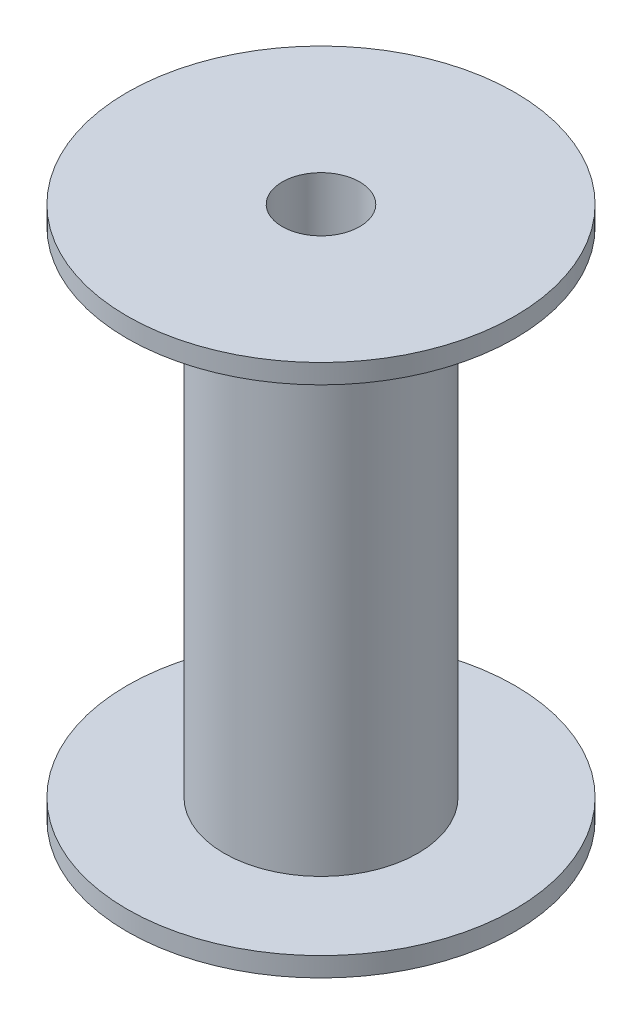
ISO-10303-21;
HEADER;
FILE_DESCRIPTION(('STEP AP214'),'2;1');
FILE_NAME('part.step','',(''),(''),'','','');
FILE_SCHEMA(('AUTOMOTIVE_DESIGN { 1 0 10303 214 1 1 1 1 }'));
ENDSEC;
DATA;
#1=APPLICATION_CONTEXT('core data for automotive mechanical design processes');
#2=APPLICATION_PROTOCOL_DEFINITION('international standard','automotive_design',2000,#1);
#3=PRODUCT_CONTEXT('',#1,'mechanical');
#4=PRODUCT('Part','Part','',(#3));
#5=PRODUCT_RELATED_PRODUCT_CATEGORY('part','',(#4));
#6=PRODUCT_DEFINITION_FORMATION('','',#4);
#7=PRODUCT_DEFINITION_CONTEXT('part definition',#1,'design');
#8=PRODUCT_DEFINITION('design','',#6,#7);
#9=PRODUCT_DEFINITION_SHAPE('','',#8);
#10=(LENGTH_UNIT() NAMED_UNIT(*) SI_UNIT(.MILLI.,.METRE.));
#11=(NAMED_UNIT(*) PLANE_ANGLE_UNIT() SI_UNIT($,.RADIAN.));
#12=(NAMED_UNIT(*) SI_UNIT($,.STERADIAN.) SOLID_ANGLE_UNIT());
#13=UNCERTAINTY_MEASURE_WITH_UNIT(LENGTH_MEASURE(1.E-05),#10,'distance_accuracy_value','');
#14=(GEOMETRIC_REPRESENTATION_CONTEXT(3) GLOBAL_UNCERTAINTY_ASSIGNED_CONTEXT((#13)) GLOBAL_UNIT_ASSIGNED_CONTEXT((#10,
#11,#12)) REPRESENTATION_CONTEXT('',''));
#15=CARTESIAN_POINT('',(0.,0.,0.));
#16=DIRECTION('',(0.,0.,1.));
#17=DIRECTION('',(1.,0.,0.));
#18=AXIS2_PLACEMENT_3D('',#15,#16,#17);
#19=CARTESIAN_POINT('',(0.,55.,0.));
#20=DIRECTION('',(0.,-1.,0.));
#21=DIRECTION('',(0.,0.,-1.));
#22=AXIS2_PLACEMENT_3D('',#19,#20,#21);
#23=CYLINDRICAL_SURFACE('',#22,20.);
#24=CARTESIAN_POINT('',(0.,0.,0.));
#25=DIRECTION('',(0.,1.,0.));
#26=DIRECTION('',(0.,0.,1.));
#27=AXIS2_PLACEMENT_3D('',#24,#25,#26);
#28=CIRCLE('',#27,20.);
#29=CARTESIAN_POINT('',(0.,0.,20.));
#30=VERTEX_POINT('',#29);
#31=EDGE_CURVE('E35',#30,#30,#28,.T.);
#32=ORIENTED_EDGE('',*,*,#31,.T.);
#33=EDGE_LOOP('',(#32));
#34=FACE_BOUND('',#33,.T.);
#35=CARTESIAN_POINT('',(0.,2.,0.));
#36=DIRECTION('',(0.,1.,0.));
#37=DIRECTION('',(0.,0.,1.));
#38=AXIS2_PLACEMENT_3D('',#35,#36,#37);
#39=CIRCLE('',#38,20.);
#40=CARTESIAN_POINT('',(0.,2.,20.));
#41=VERTEX_POINT('',#40);
#42=EDGE_CURVE('E47',#41,#41,#39,.T.);
#43=ORIENTED_EDGE('',*,*,#42,.F.);
#44=EDGE_LOOP('',(#43));
#45=FACE_BOUND('',#44,.T.);
#46=ADVANCED_FACE('F31',(#34,#45),#23,.T.);
#47=CARTESIAN_POINT('',(0.,55.,0.));
#48=DIRECTION('',(0.,1.,0.));
#49=DIRECTION('',(0.,0.,1.));
#50=AXIS2_PLACEMENT_3D('',#47,#48,#49);
#51=PLANE('',#50);
#52=CARTESIAN_POINT('',(0.,55.,0.));
#53=DIRECTION('',(0.,1.,0.));
#54=DIRECTION('',(0.,0.,1.));
#55=AXIS2_PLACEMENT_3D('',#52,#53,#54);
#56=CIRCLE('',#55,20.);
#57=CARTESIAN_POINT('',(0.,55.,20.));
#58=VERTEX_POINT('',#57);
#59=EDGE_CURVE('E10',#58,#58,#56,.T.);
#60=ORIENTED_EDGE('',*,*,#59,.T.);
#61=EDGE_LOOP('',(#60));
#62=FACE_BOUND('',#61,.T.);
#63=CARTESIAN_POINT('',(0.,55.,0.));
#64=DIRECTION('',(0.,1.,0.));
#65=DIRECTION('',(0.,0.,1.));
#66=AXIS2_PLACEMENT_3D('',#63,#64,#65);
#67=CIRCLE('',#66,4.);
#68=CARTESIAN_POINT('',(0.,55.,4.));
#69=VERTEX_POINT('',#68);
#70=EDGE_CURVE('E42',#69,#69,#67,.T.);
#71=ORIENTED_EDGE('',*,*,#70,.F.);
#72=EDGE_LOOP('',(#71));
#73=FACE_BOUND('',#72,.T.);
#74=ADVANCED_FACE('F74',(#62,#73),#51,.T.);
#75=CARTESIAN_POINT('',(0.,0.,0.));
#76=DIRECTION('',(0.,1.,0.));
#77=DIRECTION('',(0.,0.,1.));
#78=AXIS2_PLACEMENT_3D('',#75,#76,#77);
#79=PLANE('',#78);
#80=ORIENTED_EDGE('',*,*,#31,.F.);
#81=EDGE_LOOP('',(#80));
#82=FACE_BOUND('',#81,.T.);
#83=CARTESIAN_POINT('',(0.,0.,0.));
#84=DIRECTION('',(0.,1.,0.));
#85=DIRECTION('',(0.,0.,1.));
#86=AXIS2_PLACEMENT_3D('',#83,#84,#85);
#87=CIRCLE('',#86,4.);
#88=CARTESIAN_POINT('',(0.,0.,4.));
#89=VERTEX_POINT('',#88);
#90=EDGE_CURVE('E44',#89,#89,#87,.T.);
#91=ORIENTED_EDGE('',*,*,#90,.T.);
#92=EDGE_LOOP('',(#91));
#93=FACE_BOUND('',#92,.T.);
#94=ADVANCED_FACE('F79',(#82,#93),#79,.F.);
#95=CARTESIAN_POINT('',(0.,53.,0.));
#96=DIRECTION('',(0.,1.,0.));
#97=DIRECTION('',(0.,0.,1.));
#98=AXIS2_PLACEMENT_3D('',#95,#96,#97);
#99=CIRCLE('',#98,20.);
#100=CARTESIAN_POINT('',(0.,53.,20.));
#101=VERTEX_POINT('',#100);
#102=EDGE_CURVE('E50',#101,#101,#99,.T.);
#103=ORIENTED_EDGE('',*,*,#102,.T.);
#104=EDGE_LOOP('',(#103));
#105=FACE_BOUND('',#104,.T.);
#106=ORIENTED_EDGE('',*,*,#59,.F.);
#107=EDGE_LOOP('',(#106));
#108=FACE_BOUND('',#107,.T.);
#109=ADVANCED_FACE('F33',(#105,#108),#23,.T.);
#110=CARTESIAN_POINT('',(0.,55.,0.));
#111=DIRECTION('',(0.,-1.,0.));
#112=DIRECTION('',(0.,0.,-1.));
#113=AXIS2_PLACEMENT_3D('',#110,#111,#112);
#114=CYLINDRICAL_SURFACE('',#113,4.);
#115=ORIENTED_EDGE('',*,*,#70,.T.);
#116=EDGE_LOOP('',(#115));
#117=FACE_BOUND('',#116,.T.);
#118=ORIENTED_EDGE('',*,*,#90,.F.);
#119=EDGE_LOOP('',(#118));
#120=FACE_BOUND('',#119,.T.);
#121=ADVANCED_FACE('F69',(#117,#120),#114,.F.);
#122=CARTESIAN_POINT('',(0.,2.,0.));
#123=DIRECTION('',(0.,1.,0.));
#124=DIRECTION('',(0.,0.,1.));
#125=AXIS2_PLACEMENT_3D('',#122,#123,#124);
#126=PLANE('',#125);
#127=CARTESIAN_POINT('',(0.,2.,0.));
#128=DIRECTION('',(0.,1.,0.));
#129=DIRECTION('',(0.,0.,1.));
#130=AXIS2_PLACEMENT_3D('',#127,#128,#129);
#131=CIRCLE('',#130,10.);
#132=CARTESIAN_POINT('',(0.,2.,10.));
#133=VERTEX_POINT('',#132);
#134=EDGE_CURVE('E53',#133,#133,#131,.T.);
#135=ORIENTED_EDGE('',*,*,#134,.F.);
#136=EDGE_LOOP('',(#135));
#137=FACE_BOUND('',#136,.T.);
#138=ORIENTED_EDGE('',*,*,#42,.T.);
#139=EDGE_LOOP('',(#138));
#140=FACE_BOUND('',#139,.T.);
#141=ADVANCED_FACE('F65',(#137,#140),#126,.T.);
#142=CARTESIAN_POINT('',(0.,53.,0.));
#143=DIRECTION('',(0.,1.,0.));
#144=DIRECTION('',(0.,0.,1.));
#145=AXIS2_PLACEMENT_3D('',#142,#143,#144);
#146=PLANE('',#145);
#147=CARTESIAN_POINT('',(0.,53.,0.));
#148=DIRECTION('',(0.,1.,0.));
#149=DIRECTION('',(0.,0.,1.));
#150=AXIS2_PLACEMENT_3D('',#147,#148,#149);
#151=CIRCLE('',#150,10.);
#152=CARTESIAN_POINT('',(0.,53.,10.));
#153=VERTEX_POINT('',#152);
#154=EDGE_CURVE('E56',#153,#153,#151,.T.);
#155=ORIENTED_EDGE('',*,*,#154,.T.);
#156=EDGE_LOOP('',(#155));
#157=FACE_BOUND('',#156,.T.);
#158=ORIENTED_EDGE('',*,*,#102,.F.);
#159=EDGE_LOOP('',(#158));
#160=FACE_BOUND('',#159,.T.);
#161=ADVANCED_FACE('F68',(#157,#160),#146,.F.);
#162=CARTESIAN_POINT('',(0.,2.,0.));
#163=DIRECTION('',(0.,1.,0.));
#164=DIRECTION('',(0.,0.,1.));
#165=AXIS2_PLACEMENT_3D('',#162,#163,#164);
#166=CYLINDRICAL_SURFACE('',#165,10.);
#167=ORIENTED_EDGE('',*,*,#134,.T.);
#168=EDGE_LOOP('',(#167));
#169=FACE_BOUND('',#168,.T.);
#170=ORIENTED_EDGE('',*,*,#154,.F.);
#171=EDGE_LOOP('',(#170));
#172=FACE_BOUND('',#171,.T.);
#173=ADVANCED_FACE('F62',(#169,#172),#166,.T.);
#174=CLOSED_SHELL('',(#46,#74,#94,#109,#121,#141,#161,#173));
#175=MANIFOLD_SOLID_BREP('B2',#174);
#176=ADVANCED_BREP_SHAPE_REPRESENTATION('',(#18,#175),#14);
#177=SHAPE_DEFINITION_REPRESENTATION(#9,#176);
ENDSEC;
END-ISO-10303-21;
